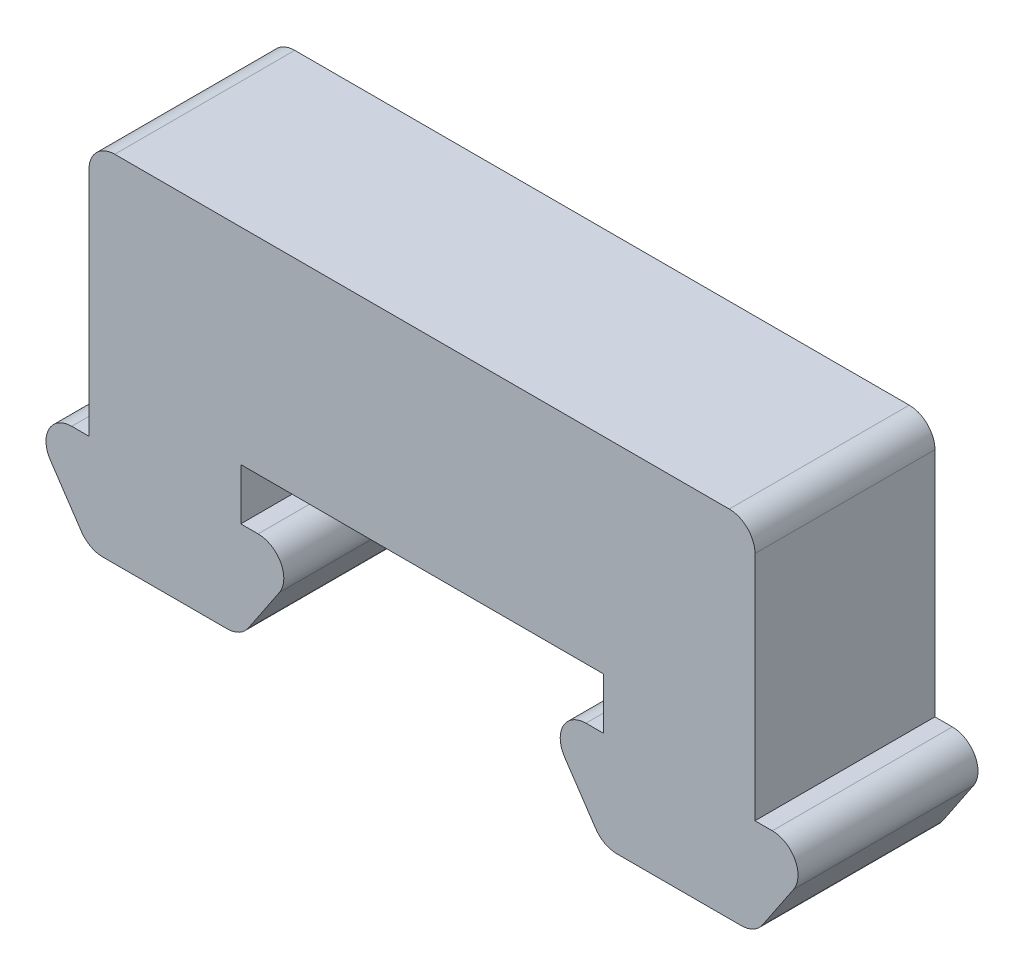
ISO-10303-21;
HEADER;
FILE_DESCRIPTION(('STEP AP214'),'2;1');
FILE_NAME('part.step','',(''),(''),'','','');
FILE_SCHEMA(('AUTOMOTIVE_DESIGN { 1 0 10303 214 1 1 1 1 }'));
ENDSEC;
DATA;
#1=APPLICATION_CONTEXT('core data for automotive mechanical design processes');
#2=APPLICATION_PROTOCOL_DEFINITION('international standard','automotive_design',2000,#1);
#3=PRODUCT_CONTEXT('',#1,'mechanical');
#4=PRODUCT('Part','Part','',(#3));
#5=PRODUCT_RELATED_PRODUCT_CATEGORY('part','',(#4));
#6=PRODUCT_DEFINITION_FORMATION('','',#4);
#7=PRODUCT_DEFINITION_CONTEXT('part definition',#1,'design');
#8=PRODUCT_DEFINITION('design','',#6,#7);
#9=PRODUCT_DEFINITION_SHAPE('','',#8);
#10=(LENGTH_UNIT() NAMED_UNIT(*) SI_UNIT(.MILLI.,.METRE.));
#11=(NAMED_UNIT(*) PLANE_ANGLE_UNIT() SI_UNIT($,.RADIAN.));
#12=(NAMED_UNIT(*) SI_UNIT($,.STERADIAN.) SOLID_ANGLE_UNIT());
#13=UNCERTAINTY_MEASURE_WITH_UNIT(LENGTH_MEASURE(1.E-05),#10,'distance_accuracy_value','');
#14=(GEOMETRIC_REPRESENTATION_CONTEXT(3) GLOBAL_UNCERTAINTY_ASSIGNED_CONTEXT((#13)) GLOBAL_UNIT_ASSIGNED_CONTEXT((#10,
#11,#12)) REPRESENTATION_CONTEXT('',''));
#15=CARTESIAN_POINT('',(0.,0.,0.));
#16=DIRECTION('',(0.,0.,1.));
#17=DIRECTION('',(1.,0.,0.));
#18=AXIS2_PLACEMENT_3D('',#15,#16,#17);
#19=CARTESIAN_POINT('',(-7.05,0.,5.));
#20=DIRECTION('',(-1.,0.,0.));
#21=DIRECTION('',(0.,0.,1.));
#22=AXIS2_PLACEMENT_3D('',#19,#20,#21);
#23=PLANE('',#22);
#24=DIRECTION('',(0.,1.,0.));
#25=VECTOR('',#24,1.);
#26=CARTESIAN_POINT('',(-7.05,0.,0.));
#27=LINE('',#26,#25);
#28=CARTESIAN_POINT('',(-7.05,0.,0.));
#29=VERTEX_POINT('',#28);
#30=CARTESIAN_POINT('',(-7.05,2.,0.));
#31=VERTEX_POINT('',#30);
#32=EDGE_CURVE('E317',#29,#31,#27,.T.);
#33=ORIENTED_EDGE('',*,*,#32,.T.);
#34=DIRECTION('',(0.,0.,-1.));
#35=VECTOR('',#34,1.);
#36=CARTESIAN_POINT('',(-7.05,2.,5.));
#37=LINE('',#36,#35);
#38=CARTESIAN_POINT('',(-7.05,2.,7.));
#39=VERTEX_POINT('',#38);
#40=EDGE_CURVE('E277',#39,#31,#37,.T.);
#41=ORIENTED_EDGE('',*,*,#40,.F.);
#42=DIRECTION('',(0.,-1.,0.));
#43=VECTOR('',#42,1.);
#44=CARTESIAN_POINT('',(-7.05,0.,7.));
#45=LINE('',#44,#43);
#46=CARTESIAN_POINT('',(-7.05,0.,7.));
#47=VERTEX_POINT('',#46);
#48=EDGE_CURVE('E270',#39,#47,#45,.T.);
#49=ORIENTED_EDGE('',*,*,#48,.T.);
#50=DIRECTION('',(0.,0.,-1.));
#51=VECTOR('',#50,1.);
#52=CARTESIAN_POINT('',(-7.05,0.,5.));
#53=LINE('',#52,#51);
#54=EDGE_CURVE('E251',#47,#29,#53,.T.);
#55=ORIENTED_EDGE('',*,*,#54,.T.);
#56=EDGE_LOOP('',(#33,#41,#49,#55));
#57=FACE_BOUND('',#56,.T.);
#58=ADVANCED_FACE('F39',(#57),#23,.F.);
#59=CARTESIAN_POINT('',(-4.6,0.,5.));
#60=DIRECTION('',(1.,0.,0.));
#61=DIRECTION('',(0.,1.,0.));
#62=AXIS2_PLACEMENT_3D('',#59,#60,#61);
#63=PLANE('',#62);
#64=DIRECTION('',(0.,-1.,0.));
#65=VECTOR('',#64,1.);
#66=CARTESIAN_POINT('',(-4.6,0.,5.));
#67=LINE('',#66,#65);
#68=CARTESIAN_POINT('',(-4.6,8.5,5.));
#69=VERTEX_POINT('',#68);
#70=CARTESIAN_POINT('',(-4.6,2.99999999999999,5.));
#71=VERTEX_POINT('',#70);
#72=EDGE_CURVE('E319',#69,#71,#67,.T.);
#73=ORIENTED_EDGE('',*,*,#72,.T.);
#74=DIRECTION('',(0.,0.,-1.));
#75=VECTOR('',#74,1.);
#76=CARTESIAN_POINT('',(-4.6,2.99999999999999,0.));
#77=LINE('',#76,#75);
#78=CARTESIAN_POINT('',(-4.6,2.99999999999999,0.));
#79=VERTEX_POINT('',#78);
#80=EDGE_CURVE('E396',#71,#79,#77,.T.);
#81=ORIENTED_EDGE('',*,*,#80,.T.);
#82=DIRECTION('',(0.,-1.,0.));
#83=VECTOR('',#82,1.);
#84=CARTESIAN_POINT('',(-4.6,0.,0.));
#85=LINE('',#84,#83);
#86=CARTESIAN_POINT('',(-4.6,8.5,0.));
#87=VERTEX_POINT('',#86);
#88=EDGE_CURVE('E331',#87,#79,#85,.T.);
#89=ORIENTED_EDGE('',*,*,#88,.F.);
#90=DIRECTION('',(0.,0.,-1.));
#91=VECTOR('',#90,1.);
#92=CARTESIAN_POINT('',(-4.6,8.5,5.));
#93=LINE('',#92,#91);
#94=EDGE_CURVE('E392',#69,#87,#93,.T.);
#95=ORIENTED_EDGE('',*,*,#94,.F.);
#96=EDGE_LOOP('',(#73,#81,#89,#95));
#97=FACE_BOUND('',#96,.T.);
#98=ADVANCED_FACE('F504',(#97),#63,.T.);
#99=CARTESIAN_POINT('',(0.,8.5,5.));
#100=DIRECTION('',(0.,1.,0.));
#101=DIRECTION('',(0.,0.,1.));
#102=AXIS2_PLACEMENT_3D('',#99,#100,#101);
#103=PLANE('',#102);
#104=DIRECTION('',(1.,0.,0.));
#105=VECTOR('',#104,1.);
#106=CARTESIAN_POINT('',(0.,8.5,0.));
#107=LINE('',#106,#105);
#108=CARTESIAN_POINT('',(4.6,8.5,0.));
#109=VERTEX_POINT('',#108);
#110=EDGE_CURVE('E335',#87,#109,#107,.T.);
#111=ORIENTED_EDGE('',*,*,#110,.T.);
#112=DIRECTION('',(0.,0.,-1.));
#113=VECTOR('',#112,1.);
#114=CARTESIAN_POINT('',(4.6,8.5,5.));
#115=LINE('',#114,#113);
#116=CARTESIAN_POINT('',(4.6,8.5,5.));
#117=VERTEX_POINT('',#116);
#118=EDGE_CURVE('E389',#117,#109,#115,.T.);
#119=ORIENTED_EDGE('',*,*,#118,.F.);
#120=DIRECTION('',(1.,0.,0.));
#121=VECTOR('',#120,1.);
#122=CARTESIAN_POINT('',(0.,8.5,5.));
#123=LINE('',#122,#121);
#124=EDGE_CURVE('E322',#69,#117,#123,.T.);
#125=ORIENTED_EDGE('',*,*,#124,.F.);
#126=ORIENTED_EDGE('',*,*,#94,.T.);
#127=EDGE_LOOP('',(#111,#119,#125,#126));
#128=FACE_BOUND('',#127,.T.);
#129=ADVANCED_FACE('F538',(#128),#103,.F.);
#130=CARTESIAN_POINT('',(4.6,0.,5.));
#131=DIRECTION('',(1.,0.,0.));
#132=DIRECTION('',(0.,1.,0.));
#133=AXIS2_PLACEMENT_3D('',#130,#131,#132);
#134=PLANE('',#133);
#135=DIRECTION('',(0.,-1.,0.));
#136=VECTOR('',#135,1.);
#137=CARTESIAN_POINT('',(4.6,0.,0.));
#138=LINE('',#137,#136);
#139=CARTESIAN_POINT('',(4.6,3.,0.));
#140=VERTEX_POINT('',#139);
#141=EDGE_CURVE('E338',#109,#140,#138,.T.);
#142=ORIENTED_EDGE('',*,*,#141,.T.);
#143=DIRECTION('',(0.,0.,-1.));
#144=VECTOR('',#143,1.);
#145=CARTESIAN_POINT('',(4.6,3.,5.));
#146=LINE('',#145,#144);
#147=CARTESIAN_POINT('',(4.6,3.,5.));
#148=VERTEX_POINT('',#147);
#149=EDGE_CURVE('E429',#140,#148,#146,.F.);
#150=ORIENTED_EDGE('',*,*,#149,.T.);
#151=DIRECTION('',(0.,-1.,0.));
#152=VECTOR('',#151,1.);
#153=CARTESIAN_POINT('',(4.6,0.,5.));
#154=LINE('',#153,#152);
#155=EDGE_CURVE('E264',#117,#148,#154,.T.);
#156=ORIENTED_EDGE('',*,*,#155,.F.);
#157=ORIENTED_EDGE('',*,*,#118,.T.);
#158=EDGE_LOOP('',(#142,#150,#156,#157));
#159=FACE_BOUND('',#158,.T.);
#160=ADVANCED_FACE('F601',(#159),#134,.F.);
#161=CARTESIAN_POINT('',(0.,1.99999999999999,5.));
#162=DIRECTION('',(0.,1.,0.));
#163=DIRECTION('',(-1.,0.,0.));
#164=AXIS2_PLACEMENT_3D('',#161,#162,#163);
#165=PLANE('',#164);
#166=DIRECTION('',(1.,0.,0.));
#167=VECTOR('',#166,1.);
#168=CARTESIAN_POINT('',(0.,2.,0.));
#169=LINE('',#168,#167);
#170=CARTESIAN_POINT('',(-5.6,2.,0.));
#171=VERTEX_POINT('',#170);
#172=EDGE_CURVE('E328',#31,#171,#169,.T.);
#173=ORIENTED_EDGE('',*,*,#172,.T.);
#174=DIRECTION('',(0.,0.,-1.));
#175=VECTOR('',#174,1.);
#176=CARTESIAN_POINT('',(-5.6,1.99999999999999,5.));
#177=LINE('',#176,#175);
#178=CARTESIAN_POINT('',(-5.6,2.,5.));
#179=VERTEX_POINT('',#178);
#180=EDGE_CURVE('E426',#171,#179,#177,.F.);
#181=ORIENTED_EDGE('',*,*,#180,.T.);
#182=DIRECTION('',(-1.,0.,0.));
#183=VECTOR('',#182,1.);
#184=CARTESIAN_POINT('',(0.,2.,5.));
#185=LINE('',#184,#183);
#186=CARTESIAN_POINT('',(5.6,2.,5.));
#187=VERTEX_POINT('',#186);
#188=EDGE_CURVE('E278',#187,#179,#185,.T.);
#189=ORIENTED_EDGE('',*,*,#188,.F.);
#190=DIRECTION('',(0.,0.,-1.));
#191=VECTOR('',#190,1.);
#192=CARTESIAN_POINT('',(5.6,2.,5.));
#193=LINE('',#192,#191);
#194=CARTESIAN_POINT('',(5.6,2.,0.));
#195=VERTEX_POINT('',#194);
#196=EDGE_CURVE('E423',#187,#195,#193,.T.);
#197=ORIENTED_EDGE('',*,*,#196,.T.);
#198=DIRECTION('',(1.,0.,0.));
#199=VECTOR('',#198,1.);
#200=CARTESIAN_POINT('',(0.,1.99999999999999,0.));
#201=LINE('',#200,#199);
#202=CARTESIAN_POINT('',(7.05,2.,0.));
#203=VERTEX_POINT('',#202);
#204=EDGE_CURVE('E341',#195,#203,#201,.T.);
#205=ORIENTED_EDGE('',*,*,#204,.T.);
#206=DIRECTION('',(0.,0.,-1.));
#207=VECTOR('',#206,1.);
#208=CARTESIAN_POINT('',(7.05,2.,5.));
#209=LINE('',#208,#207);
#210=CARTESIAN_POINT('',(7.05,2.,7.));
#211=VERTEX_POINT('',#210);
#212=EDGE_CURVE('E386',#211,#203,#209,.T.);
#213=ORIENTED_EDGE('',*,*,#212,.F.);
#214=DIRECTION('',(-1.,0.,0.));
#215=VECTOR('',#214,1.);
#216=CARTESIAN_POINT('',(0.,2.,7.));
#217=LINE('',#216,#215);
#218=EDGE_CURVE('E316',#211,#39,#217,.T.);
#219=ORIENTED_EDGE('',*,*,#218,.T.);
#220=ORIENTED_EDGE('',*,*,#40,.T.);
#221=EDGE_LOOP('',(#173,#181,#189,#197,#205,#213,#219,#220));
#222=FACE_BOUND('',#221,.T.);
#223=ADVANCED_FACE('F512',(#222),#165,.F.);
#224=CARTESIAN_POINT('',(7.05,0.,5.));
#225=DIRECTION('',(-1.,0.,0.));
#226=DIRECTION('',(0.,-1.,0.));
#227=AXIS2_PLACEMENT_3D('',#224,#225,#226);
#228=PLANE('',#227);
#229=DIRECTION('',(0.,1.,0.));
#230=VECTOR('',#229,1.);
#231=CARTESIAN_POINT('',(7.05,0.,0.));
#232=LINE('',#231,#230);
#233=CARTESIAN_POINT('',(7.05,0.,0.));
#234=VERTEX_POINT('',#233);
#235=EDGE_CURVE('E343',#234,#203,#232,.T.);
#236=ORIENTED_EDGE('',*,*,#235,.F.);
#237=DIRECTION('',(0.,0.,-1.));
#238=VECTOR('',#237,1.);
#239=CARTESIAN_POINT('',(7.05,0.,5.));
#240=LINE('',#239,#238);
#241=CARTESIAN_POINT('',(7.05,0.,7.));
#242=VERTEX_POINT('',#241);
#243=EDGE_CURVE('E383',#242,#234,#240,.T.);
#244=ORIENTED_EDGE('',*,*,#243,.F.);
#245=DIRECTION('',(0.,-1.,0.));
#246=VECTOR('',#245,1.);
#247=CARTESIAN_POINT('',(7.05,0.,7.));
#248=LINE('',#247,#246);
#249=EDGE_CURVE('E313',#211,#242,#248,.T.);
#250=ORIENTED_EDGE('',*,*,#249,.F.);
#251=ORIENTED_EDGE('',*,*,#212,.T.);
#252=EDGE_LOOP('',(#236,#244,#250,#251));
#253=FACE_BOUND('',#252,.T.);
#254=ADVANCED_FACE('F595',(#253),#228,.T.);
#255=CARTESIAN_POINT('',(0.,0.,5.));
#256=DIRECTION('',(0.,1.,0.));
#257=DIRECTION('',(-1.,0.,0.));
#258=AXIS2_PLACEMENT_3D('',#255,#256,#257);
#259=PLANE('',#258);
#260=DIRECTION('',(1.,0.,0.));
#261=VECTOR('',#260,1.);
#262=CARTESIAN_POINT('',(0.,0.,0.));
#263=LINE('',#262,#261);
#264=CARTESIAN_POINT('',(6.37534148162657,0.,0.));
#265=VERTEX_POINT('',#264);
#266=EDGE_CURVE('E346',#265,#234,#263,.T.);
#267=ORIENTED_EDGE('',*,*,#266,.F.);
#268=DIRECTION('',(0.,0.,-1.));
#269=VECTOR('',#268,1.);
#270=CARTESIAN_POINT('',(6.37534148162657,0.,5.));
#271=LINE('',#270,#269);
#272=CARTESIAN_POINT('',(6.37534148162657,0.,7.));
#273=VERTEX_POINT('',#272);
#274=EDGE_CURVE('E495',#265,#273,#271,.F.);
#275=ORIENTED_EDGE('',*,*,#274,.T.);
#276=DIRECTION('',(-1.,0.,0.));
#277=VECTOR('',#276,1.);
#278=CARTESIAN_POINT('',(0.,0.,7.));
#279=LINE('',#278,#277);
#280=EDGE_CURVE('E310',#242,#273,#279,.T.);
#281=ORIENTED_EDGE('',*,*,#280,.F.);
#282=ORIENTED_EDGE('',*,*,#243,.T.);
#283=EDGE_LOOP('',(#267,#275,#281,#282));
#284=FACE_BOUND('',#283,.T.);
#285=ADVANCED_FACE('F583',(#284),#259,.T.);
#286=CARTESIAN_POINT('',(3.10278142533126,2.08212964068282,5.));
#287=DIRECTION('',(-0.83036557214696,-0.557219002361776,0.));
#288=DIRECTION('',(0.557219002361776,-0.83036557214696,0.));
#289=AXIS2_PLACEMENT_3D('',#286,#287,#288);
#290=PLANE('',#289);
#291=DIRECTION('',(-0.557219002361776,0.83036557214696,0.));
#292=VECTOR('',#291,1.);
#293=CARTESIAN_POINT('',(3.10278142533126,2.08212964068282,0.));
#294=LINE('',#293,#292);
#295=CARTESIAN_POINT('',(6.75287064632172,-3.35721900236178,0.));
#296=VERTEX_POINT('',#295);
#297=CARTESIAN_POINT('',(5.54497590947962,-1.55721900236178,0.));
#298=VERTEX_POINT('',#297);
#299=EDGE_CURVE('E348',#296,#298,#294,.T.);
#300=ORIENTED_EDGE('',*,*,#299,.F.);
#301=DIRECTION('',(0.,0.,-1.));
#302=VECTOR('',#301,1.);
#303=CARTESIAN_POINT('',(6.75287064632172,-3.35721900236177,7.));
#304=LINE('',#303,#302);
#305=CARTESIAN_POINT('',(6.75287064632172,-3.35721900236178,7.));
#306=VERTEX_POINT('',#305);
#307=EDGE_CURVE('E493',#296,#306,#304,.F.);
#308=ORIENTED_EDGE('',*,*,#307,.T.);
#309=DIRECTION('',(0.557219002361776,-0.83036557214696,0.));
#310=VECTOR('',#309,1.);
#311=CARTESIAN_POINT('',(3.10278142533126,2.08212964068282,7.));
#312=LINE('',#311,#310);
#313=CARTESIAN_POINT('',(5.54497590947962,-1.55721900236178,7.));
#314=VERTEX_POINT('',#313);
#315=EDGE_CURVE('E307',#314,#306,#312,.T.);
#316=ORIENTED_EDGE('',*,*,#315,.F.);
#317=DIRECTION('',(0.,0.,-1.));
#318=VECTOR('',#317,1.);
#319=CARTESIAN_POINT('',(5.54497590947961,-1.55721900236178,5.));
#320=LINE('',#319,#318);
#321=EDGE_CURVE('E490',#314,#298,#320,.T.);
#322=ORIENTED_EDGE('',*,*,#321,.T.);
#323=EDGE_LOOP('',(#300,#308,#316,#322));
#324=FACE_BOUND('',#323,.T.);
#325=ADVANCED_FACE('F590',(#324),#290,.T.);
#326=CARTESIAN_POINT('',(0.,-3.8,5.));
#327=DIRECTION('',(0.,1.,0.));
#328=DIRECTION('',(-1.,0.,0.));
#329=AXIS2_PLACEMENT_3D('',#326,#327,#328);
#330=PLANE('',#329);
#331=DIRECTION('',(1.,0.,0.));
#332=VECTOR('',#331,1.);
#333=CARTESIAN_POINT('',(0.,-3.8,0.));
#334=LINE('',#333,#332);
#335=CARTESIAN_POINT('',(7.58323621846868,-3.8,0.));
#336=VERTEX_POINT('',#335);
#337=CARTESIAN_POINT('',(12.4167637815313,-3.8,0.));
#338=VERTEX_POINT('',#337);
#339=EDGE_CURVE('E352',#336,#338,#334,.T.);
#340=ORIENTED_EDGE('',*,*,#339,.T.);
#341=DIRECTION('',(0.,0.,-1.));
#342=VECTOR('',#341,1.);
#343=CARTESIAN_POINT('',(12.4167637815313,-3.8,5.));
#344=LINE('',#343,#342);
#345=CARTESIAN_POINT('',(12.4167637815313,-3.8,7.));
#346=VERTEX_POINT('',#345);
#347=EDGE_CURVE('E488',#338,#346,#344,.F.);
#348=ORIENTED_EDGE('',*,*,#347,.T.);
#349=DIRECTION('',(-1.,0.,0.));
#350=VECTOR('',#349,1.);
#351=CARTESIAN_POINT('',(0.,-3.8,7.));
#352=LINE('',#351,#350);
#353=CARTESIAN_POINT('',(7.58323621846868,-3.8,7.));
#354=VERTEX_POINT('',#353);
#355=EDGE_CURVE('E304',#346,#354,#352,.T.);
#356=ORIENTED_EDGE('',*,*,#355,.T.);
#357=DIRECTION('',(0.,0.,-1.));
#358=VECTOR('',#357,1.);
#359=CARTESIAN_POINT('',(7.58323621846868,-3.8,0.));
#360=LINE('',#359,#358);
#361=EDGE_CURVE('E485',#354,#336,#360,.T.);
#362=ORIENTED_EDGE('',*,*,#361,.T.);
#363=EDGE_LOOP('',(#340,#348,#356,#362));
#364=FACE_BOUND('',#363,.T.);
#365=ADVANCED_FACE('F586',(#364),#330,.F.);
#366=CARTESIAN_POINT('',(10.6873582428077,-7.17177987346305,5.));
#367=DIRECTION('',(-0.83036557214696,0.557219002361775,0.));
#368=DIRECTION('',(-0.557219002361775,-0.83036557214696,0.));
#369=AXIS2_PLACEMENT_3D('',#366,#367,#368);
#370=PLANE('',#369);
#371=DIRECTION('',(0.557219002361775,0.83036557214696,0.));
#372=VECTOR('',#371,1.);
#373=CARTESIAN_POINT('',(10.6873582428077,-7.17177987346305,0.));
#374=LINE('',#373,#372);
#375=CARTESIAN_POINT('',(13.2471293536783,-3.35721900236177,0.));
#376=VERTEX_POINT('',#375);
#377=CARTESIAN_POINT('',(14.4550240905204,-1.55721900236178,0.));
#378=VERTEX_POINT('',#377);
#379=EDGE_CURVE('E355',#376,#378,#374,.T.);
#380=ORIENTED_EDGE('',*,*,#379,.T.);
#381=DIRECTION('',(0.,0.,-1.));
#382=VECTOR('',#381,1.);
#383=CARTESIAN_POINT('',(14.4550240905204,-1.55721900236178,7.));
#384=LINE('',#383,#382);
#385=CARTESIAN_POINT('',(14.4550240905204,-1.55721900236178,7.));
#386=VERTEX_POINT('',#385);
#387=EDGE_CURVE('E483',#378,#386,#384,.F.);
#388=ORIENTED_EDGE('',*,*,#387,.T.);
#389=DIRECTION('',(-0.557219002361775,-0.83036557214696,0.));
#390=VECTOR('',#389,1.);
#391=CARTESIAN_POINT('',(10.6873582428077,-7.17177987346305,7.));
#392=LINE('',#391,#390);
#393=CARTESIAN_POINT('',(13.2471293536783,-3.35721900236177,7.));
#394=VERTEX_POINT('',#393);
#395=EDGE_CURVE('E301',#386,#394,#392,.T.);
#396=ORIENTED_EDGE('',*,*,#395,.T.);
#397=DIRECTION('',(0.,0.,-1.));
#398=VECTOR('',#397,1.);
#399=CARTESIAN_POINT('',(13.2471293536783,-3.35721900236177,5.));
#400=LINE('',#399,#398);
#401=EDGE_CURVE('E480',#394,#376,#400,.T.);
#402=ORIENTED_EDGE('',*,*,#401,.T.);
#403=EDGE_LOOP('',(#380,#388,#396,#402));
#404=FACE_BOUND('',#403,.T.);
#405=ADVANCED_FACE('F581',(#404),#370,.F.);
#406=DIRECTION('',(-1.,0.,0.));
#407=VECTOR('',#406,1.);
#408=CARTESIAN_POINT('',(0.,0.,7.));
#409=LINE('',#408,#407);
#410=CARTESIAN_POINT('',(13.6246585183734,0.,7.));
#411=VERTEX_POINT('',#410);
#412=CARTESIAN_POINT('',(12.95,0.,7.));
#413=VERTEX_POINT('',#412);
#414=EDGE_CURVE('E298',#411,#413,#409,.T.);
#415=ORIENTED_EDGE('',*,*,#414,.F.);
#416=DIRECTION('',(0.,0.,-1.));
#417=VECTOR('',#416,1.);
#418=CARTESIAN_POINT('',(13.6246585183734,0.,0.));
#419=LINE('',#418,#417);
#420=CARTESIAN_POINT('',(13.6246585183734,0.,0.));
#421=VERTEX_POINT('',#420);
#422=EDGE_CURVE('E477',#411,#421,#419,.T.);
#423=ORIENTED_EDGE('',*,*,#422,.T.);
#424=CARTESIAN_POINT('',(12.95,0.,0.));
#425=VERTEX_POINT('',#424);
#426=EDGE_CURVE('E349',#425,#421,#263,.T.);
#427=ORIENTED_EDGE('',*,*,#426,.F.);
#428=DIRECTION('',(0.,0.,-1.));
#429=VECTOR('',#428,1.);
#430=CARTESIAN_POINT('',(12.95,0.,5.));
#431=LINE('',#430,#429);
#432=EDGE_CURVE('E381',#413,#425,#431,.T.);
#433=ORIENTED_EDGE('',*,*,#432,.F.);
#434=EDGE_LOOP('',(#415,#423,#427,#433));
#435=FACE_BOUND('',#434,.T.);
#436=ADVANCED_FACE('F577',(#435),#259,.T.);
#437=CARTESIAN_POINT('',(12.95,0.,5.));
#438=DIRECTION('',(-1.,0.,0.));
#439=DIRECTION('',(0.,0.,1.));
#440=AXIS2_PLACEMENT_3D('',#437,#438,#439);
#441=PLANE('',#440);
#442=DIRECTION('',(0.,1.,0.));
#443=VECTOR('',#442,1.);
#444=CARTESIAN_POINT('',(12.95,0.,0.));
#445=LINE('',#444,#443);
#446=CARTESIAN_POINT('',(12.95,9.,0.));
#447=VERTEX_POINT('',#446);
#448=EDGE_CURVE('E358',#425,#447,#445,.T.);
#449=ORIENTED_EDGE('',*,*,#448,.T.);
#450=DIRECTION('',(0.,0.,-1.));
#451=VECTOR('',#450,1.);
#452=CARTESIAN_POINT('',(12.95,9.,7.));
#453=LINE('',#452,#451);
#454=CARTESIAN_POINT('',(12.95,9.,7.));
#455=VERTEX_POINT('',#454);
#456=EDGE_CURVE('E475',#447,#455,#453,.F.);
#457=ORIENTED_EDGE('',*,*,#456,.T.);
#458=DIRECTION('',(0.,-1.,0.));
#459=VECTOR('',#458,1.);
#460=CARTESIAN_POINT('',(12.95,0.,7.));
#461=LINE('',#460,#459);
#462=EDGE_CURVE('E296',#455,#413,#461,.T.);
#463=ORIENTED_EDGE('',*,*,#462,.T.);
#464=ORIENTED_EDGE('',*,*,#432,.T.);
#465=EDGE_LOOP('',(#449,#457,#463,#464));
#466=FACE_BOUND('',#465,.T.);
#467=ADVANCED_FACE('F573',(#466),#441,.F.);
#468=CARTESIAN_POINT('',(0.,10.,5.));
#469=DIRECTION('',(0.,1.,0.));
#470=DIRECTION('',(-1.,0.,0.));
#471=AXIS2_PLACEMENT_3D('',#468,#469,#470);
#472=PLANE('',#471);
#473=DIRECTION('',(1.,0.,0.));
#474=VECTOR('',#473,1.);
#475=CARTESIAN_POINT('',(0.,10.,0.));
#476=LINE('',#475,#474);
#477=CARTESIAN_POINT('',(-11.95,10.,0.));
#478=VERTEX_POINT('',#477);
#479=CARTESIAN_POINT('',(11.95,10.,0.));
#480=VERTEX_POINT('',#479);
#481=EDGE_CURVE('E361',#478,#480,#476,.T.);
#482=ORIENTED_EDGE('',*,*,#481,.F.);
#483=DIRECTION('',(0.,0.,-1.));
#484=VECTOR('',#483,1.);
#485=CARTESIAN_POINT('',(-11.95,10.,5.));
#486=LINE('',#485,#484);
#487=CARTESIAN_POINT('',(-11.95,10.,7.));
#488=VERTEX_POINT('',#487);
#489=EDGE_CURVE('E473',#478,#488,#486,.F.);
#490=ORIENTED_EDGE('',*,*,#489,.T.);
#491=DIRECTION('',(-1.,0.,0.));
#492=VECTOR('',#491,1.);
#493=CARTESIAN_POINT('',(0.,10.,7.));
#494=LINE('',#493,#492);
#495=CARTESIAN_POINT('',(11.95,10.,7.));
#496=VERTEX_POINT('',#495);
#497=EDGE_CURVE('E293',#496,#488,#494,.T.);
#498=ORIENTED_EDGE('',*,*,#497,.F.);
#499=DIRECTION('',(0.,0.,-1.));
#500=VECTOR('',#499,1.);
#501=CARTESIAN_POINT('',(11.95,10.,0.));
#502=LINE('',#501,#500);
#503=EDGE_CURVE('E470',#496,#480,#502,.T.);
#504=ORIENTED_EDGE('',*,*,#503,.T.);
#505=EDGE_LOOP('',(#482,#490,#498,#504));
#506=FACE_BOUND('',#505,.T.);
#507=ADVANCED_FACE('F569',(#506),#472,.T.);
#508=CARTESIAN_POINT('',(-12.95,0.,5.));
#509=DIRECTION('',(-1.,0.,0.));
#510=DIRECTION('',(0.,0.,1.));
#511=AXIS2_PLACEMENT_3D('',#508,#509,#510);
#512=PLANE('',#511);
#513=DIRECTION('',(0.,-1.,0.));
#514=VECTOR('',#513,1.);
#515=CARTESIAN_POINT('',(-12.95,0.,7.));
#516=LINE('',#515,#514);
#517=CARTESIAN_POINT('',(-12.95,9.,7.));
#518=VERTEX_POINT('',#517);
#519=CARTESIAN_POINT('',(-12.95,0.,7.));
#520=VERTEX_POINT('',#519);
#521=EDGE_CURVE('E290',#518,#520,#516,.T.);
#522=ORIENTED_EDGE('',*,*,#521,.F.);
#523=DIRECTION('',(0.,0.,-1.));
#524=VECTOR('',#523,1.);
#525=CARTESIAN_POINT('',(-12.95,9.,5.));
#526=LINE('',#525,#524);
#527=CARTESIAN_POINT('',(-12.95,9.,0.));
#528=VERTEX_POINT('',#527);
#529=EDGE_CURVE('E467',#518,#528,#526,.T.);
#530=ORIENTED_EDGE('',*,*,#529,.T.);
#531=DIRECTION('',(0.,1.,0.));
#532=VECTOR('',#531,1.);
#533=CARTESIAN_POINT('',(-12.95,0.,0.));
#534=LINE('',#533,#532);
#535=CARTESIAN_POINT('',(-12.95,0.,0.));
#536=VERTEX_POINT('',#535);
#537=EDGE_CURVE('E365',#536,#528,#534,.T.);
#538=ORIENTED_EDGE('',*,*,#537,.F.);
#539=DIRECTION('',(0.,0.,-1.));
#540=VECTOR('',#539,1.);
#541=CARTESIAN_POINT('',(-12.95,0.,5.));
#542=LINE('',#541,#540);
#543=EDGE_CURVE('E263',#520,#536,#542,.T.);
#544=ORIENTED_EDGE('',*,*,#543,.F.);
#545=EDGE_LOOP('',(#522,#530,#538,#544));
#546=FACE_BOUND('',#545,.T.);
#547=ADVANCED_FACE('F566',(#546),#512,.T.);
#548=CARTESIAN_POINT('',(0.,0.,5.));
#549=DIRECTION('',(0.,-1.,0.));
#550=DIRECTION('',(1.,0.,0.));
#551=AXIS2_PLACEMENT_3D('',#548,#549,#550);
#552=PLANE('',#551);
#553=DIRECTION('',(-1.,0.,0.));
#554=VECTOR('',#553,1.);
#555=CARTESIAN_POINT('',(0.,0.,0.));
#556=LINE('',#555,#554);
#557=CARTESIAN_POINT('',(-13.6246585183734,0.,0.));
#558=VERTEX_POINT('',#557);
#559=EDGE_CURVE('E368',#536,#558,#556,.T.);
#560=ORIENTED_EDGE('',*,*,#559,.T.);
#561=DIRECTION('',(0.,0.,-1.));
#562=VECTOR('',#561,1.);
#563=CARTESIAN_POINT('',(-13.6246585183734,0.,7.));
#564=LINE('',#563,#562);
#565=CARTESIAN_POINT('',(-13.6246585183734,0.,7.));
#566=VERTEX_POINT('',#565);
#567=EDGE_CURVE('E465',#558,#566,#564,.F.);
#568=ORIENTED_EDGE('',*,*,#567,.T.);
#569=DIRECTION('',(1.,0.,0.));
#570=VECTOR('',#569,1.);
#571=CARTESIAN_POINT('',(0.,0.,7.));
#572=LINE('',#571,#570);
#573=EDGE_CURVE('E288',#566,#520,#572,.T.);
#574=ORIENTED_EDGE('',*,*,#573,.T.);
#575=ORIENTED_EDGE('',*,*,#543,.T.);
#576=EDGE_LOOP('',(#560,#568,#574,#575));
#577=FACE_BOUND('',#576,.T.);
#578=ADVANCED_FACE('F556',(#577),#552,.F.);
#579=CARTESIAN_POINT('',(-10.6873582428077,-7.17177987346305,5.));
#580=DIRECTION('',(-0.83036557214696,-0.557219002361775,0.));
#581=DIRECTION('',(0.557219002361775,-0.83036557214696,0.));
#582=AXIS2_PLACEMENT_3D('',#579,#580,#581);
#583=PLANE('',#582);
#584=DIRECTION('',(-0.557219002361775,0.83036557214696,0.));
#585=VECTOR('',#584,1.);
#586=CARTESIAN_POINT('',(-10.6873582428077,-7.17177987346305,0.));
#587=LINE('',#586,#585);
#588=CARTESIAN_POINT('',(-13.2471293536783,-3.35721900236178,0.));
#589=VERTEX_POINT('',#588);
#590=CARTESIAN_POINT('',(-14.4550240905204,-1.55721900236178,0.));
#591=VERTEX_POINT('',#590);
#592=EDGE_CURVE('E371',#589,#591,#587,.T.);
#593=ORIENTED_EDGE('',*,*,#592,.F.);
#594=DIRECTION('',(0.,0.,-1.));
#595=VECTOR('',#594,1.);
#596=CARTESIAN_POINT('',(-13.2471293536783,-3.35721900236178,5.));
#597=LINE('',#596,#595);
#598=CARTESIAN_POINT('',(-13.2471293536783,-3.35721900236178,7.));
#599=VERTEX_POINT('',#598);
#600=EDGE_CURVE('E463',#589,#599,#597,.F.);
#601=ORIENTED_EDGE('',*,*,#600,.T.);
#602=DIRECTION('',(0.557219002361775,-0.83036557214696,0.));
#603=VECTOR('',#602,1.);
#604=CARTESIAN_POINT('',(-10.6873582428077,-7.17177987346305,7.));
#605=LINE('',#604,#603);
#606=CARTESIAN_POINT('',(-14.4550240905204,-1.55721900236178,7.));
#607=VERTEX_POINT('',#606);
#608=EDGE_CURVE('E286',#607,#599,#605,.T.);
#609=ORIENTED_EDGE('',*,*,#608,.F.);
#610=DIRECTION('',(0.,0.,-1.));
#611=VECTOR('',#610,1.);
#612=CARTESIAN_POINT('',(-14.4550240905204,-1.55721900236178,0.));
#613=LINE('',#612,#611);
#614=EDGE_CURVE('E460',#607,#591,#613,.T.);
#615=ORIENTED_EDGE('',*,*,#614,.T.);
#616=EDGE_LOOP('',(#593,#601,#609,#615));
#617=FACE_BOUND('',#616,.T.);
#618=ADVANCED_FACE('F562',(#617),#583,.T.);
#619=CARTESIAN_POINT('',(0.,-3.8,5.));
#620=DIRECTION('',(0.,-1.,0.));
#621=DIRECTION('',(0.,0.,-1.));
#622=AXIS2_PLACEMENT_3D('',#619,#620,#621);
#623=PLANE('',#622);
#624=DIRECTION('',(-1.,0.,0.));
#625=VECTOR('',#624,1.);
#626=CARTESIAN_POINT('',(0.,-3.8,0.));
#627=LINE('',#626,#625);
#628=CARTESIAN_POINT('',(-7.58323621846867,-3.8,0.));
#629=VERTEX_POINT('',#628);
#630=CARTESIAN_POINT('',(-12.4167637815313,-3.8,0.));
#631=VERTEX_POINT('',#630);
#632=EDGE_CURVE('E374',#629,#631,#627,.T.);
#633=ORIENTED_EDGE('',*,*,#632,.F.);
#634=DIRECTION('',(0.,0.,-1.));
#635=VECTOR('',#634,1.);
#636=CARTESIAN_POINT('',(-7.58323621846867,-3.8,7.));
#637=LINE('',#636,#635);
#638=CARTESIAN_POINT('',(-7.58323621846867,-3.8,7.));
#639=VERTEX_POINT('',#638);
#640=EDGE_CURVE('E54',#629,#639,#637,.F.);
#641=ORIENTED_EDGE('',*,*,#640,.T.);
#642=DIRECTION('',(1.,0.,0.));
#643=VECTOR('',#642,1.);
#644=CARTESIAN_POINT('',(0.,-3.8,7.));
#645=LINE('',#644,#643);
#646=CARTESIAN_POINT('',(-12.4167637815313,-3.8,7.));
#647=VERTEX_POINT('',#646);
#648=EDGE_CURVE('E284',#647,#639,#645,.T.);
#649=ORIENTED_EDGE('',*,*,#648,.F.);
#650=DIRECTION('',(0.,0.,-1.));
#651=VECTOR('',#650,1.);
#652=CARTESIAN_POINT('',(-12.4167637815313,-3.8,5.));
#653=LINE('',#652,#651);
#654=EDGE_CURVE('E456',#647,#631,#653,.T.);
#655=ORIENTED_EDGE('',*,*,#654,.T.);
#656=EDGE_LOOP('',(#633,#641,#649,#655));
#657=FACE_BOUND('',#656,.T.);
#658=ADVANCED_FACE('F559',(#657),#623,.T.);
#659=CARTESIAN_POINT('',(-3.10278142533127,2.08212964068282,5.));
#660=DIRECTION('',(-0.83036557214696,0.557219002361775,0.));
#661=DIRECTION('',(-0.557219002361775,-0.83036557214696,0.));
#662=AXIS2_PLACEMENT_3D('',#659,#660,#661);
#663=PLANE('',#662);
#664=DIRECTION('',(0.557219002361775,0.83036557214696,0.));
#665=VECTOR('',#664,1.);
#666=CARTESIAN_POINT('',(-3.10278142533127,2.08212964068282,0.));
#667=LINE('',#666,#665);
#668=CARTESIAN_POINT('',(-6.75287064632171,-3.35721900236177,0.));
#669=VERTEX_POINT('',#668);
#670=CARTESIAN_POINT('',(-5.54497590947961,-1.55721900236178,0.));
#671=VERTEX_POINT('',#670);
#672=EDGE_CURVE('E377',#669,#671,#667,.T.);
#673=ORIENTED_EDGE('',*,*,#672,.T.);
#674=DIRECTION('',(0.,0.,-1.));
#675=VECTOR('',#674,1.);
#676=CARTESIAN_POINT('',(-5.54497590947961,-1.55721900236178,5.));
#677=LINE('',#676,#675);
#678=CARTESIAN_POINT('',(-5.54497590947961,-1.55721900236178,7.));
#679=VERTEX_POINT('',#678);
#680=EDGE_CURVE('E436',#671,#679,#677,.F.);
#681=ORIENTED_EDGE('',*,*,#680,.T.);
#682=DIRECTION('',(-0.557219002361775,-0.83036557214696,0.));
#683=VECTOR('',#682,1.);
#684=CARTESIAN_POINT('',(-3.10278142533127,2.08212964068282,7.));
#685=LINE('',#684,#683);
#686=CARTESIAN_POINT('',(-6.75287064632172,-3.35721900236178,7.));
#687=VERTEX_POINT('',#686);
#688=EDGE_CURVE('E274',#679,#687,#685,.T.);
#689=ORIENTED_EDGE('',*,*,#688,.T.);
#690=DIRECTION('',(0.,0.,-1.));
#691=VECTOR('',#690,1.);
#692=CARTESIAN_POINT('',(-6.75287064632171,-3.35721900236178,0.));
#693=LINE('',#692,#691);
#694=EDGE_CURVE('E433',#687,#669,#693,.T.);
#695=ORIENTED_EDGE('',*,*,#694,.T.);
#696=EDGE_LOOP('',(#673,#681,#689,#695));
#697=FACE_BOUND('',#696,.T.);
#698=ADVANCED_FACE('F517',(#697),#663,.F.);
#699=DIRECTION('',(1.,0.,0.));
#700=VECTOR('',#699,1.);
#701=CARTESIAN_POINT('',(0.,0.,7.));
#702=LINE('',#701,#700);
#703=CARTESIAN_POINT('',(-6.37534148162657,0.,7.));
#704=VERTEX_POINT('',#703);
#705=EDGE_CURVE('E255',#47,#704,#702,.T.);
#706=ORIENTED_EDGE('',*,*,#705,.T.);
#707=DIRECTION('',(0.,0.,-1.));
#708=VECTOR('',#707,1.);
#709=CARTESIAN_POINT('',(-6.37534148162657,0.,5.));
#710=LINE('',#709,#708);
#711=CARTESIAN_POINT('',(-6.37534148162657,0.,0.));
#712=VERTEX_POINT('',#711);
#713=EDGE_CURVE('E431',#704,#712,#710,.T.);
#714=ORIENTED_EDGE('',*,*,#713,.T.);
#715=EDGE_CURVE('E258',#712,#29,#556,.T.);
#716=ORIENTED_EDGE('',*,*,#715,.T.);
#717=ORIENTED_EDGE('',*,*,#54,.F.);
#718=EDGE_LOOP('',(#706,#714,#716,#717));
#719=FACE_BOUND('',#718,.T.);
#720=ADVANCED_FACE('F253',(#719),#552,.F.);
#721=CARTESIAN_POINT('',(0.,0.,0.));
#722=DIRECTION('',(0.,0.,1.));
#723=DIRECTION('',(1.,0.,0.));
#724=AXIS2_PLACEMENT_3D('',#721,#722,#723);
#725=PLANE('',#724);
#726=ORIENTED_EDGE('',*,*,#88,.T.);
#727=CARTESIAN_POINT('',(-5.6,2.99999999999999,0.));
#728=DIRECTION('',(0.,0.,1.));
#729=DIRECTION('',(1.,0.,0.));
#730=AXIS2_PLACEMENT_3D('',#727,#728,#729);
#731=CIRCLE('',#730,1.);
#732=EDGE_CURVE('E421',#79,#171,#731,.F.);
#733=ORIENTED_EDGE('',*,*,#732,.T.);
#734=ORIENTED_EDGE('',*,*,#172,.F.);
#735=ORIENTED_EDGE('',*,*,#32,.F.);
#736=ORIENTED_EDGE('',*,*,#715,.F.);
#737=CARTESIAN_POINT('',(-6.37534148162657,-1.,0.));
#738=DIRECTION('',(0.,0.,1.));
#739=DIRECTION('',(1.,0.,0.));
#740=AXIS2_PLACEMENT_3D('',#737,#738,#739);
#741=CIRCLE('',#740,1.);
#742=EDGE_CURVE('E417',#712,#671,#741,.F.);
#743=ORIENTED_EDGE('',*,*,#742,.T.);
#744=ORIENTED_EDGE('',*,*,#672,.F.);
#745=CARTESIAN_POINT('',(-7.58323621846867,-2.8,0.));
#746=DIRECTION('',(0.,0.,1.));
#747=DIRECTION('',(1.,0.,0.));
#748=AXIS2_PLACEMENT_3D('',#745,#746,#747);
#749=CIRCLE('',#748,1.);
#750=EDGE_CURVE('E415',#669,#629,#749,.F.);
#751=ORIENTED_EDGE('',*,*,#750,.T.);
#752=ORIENTED_EDGE('',*,*,#632,.T.);
#753=CARTESIAN_POINT('',(-12.4167637815313,-2.8,0.));
#754=DIRECTION('',(0.,0.,1.));
#755=DIRECTION('',(1.,0.,0.));
#756=AXIS2_PLACEMENT_3D('',#753,#754,#755);
#757=CIRCLE('',#756,1.);
#758=EDGE_CURVE('E413',#631,#589,#757,.F.);
#759=ORIENTED_EDGE('',*,*,#758,.T.);
#760=ORIENTED_EDGE('',*,*,#592,.T.);
#761=CARTESIAN_POINT('',(-13.6246585183734,-1.,0.));
#762=DIRECTION('',(0.,0.,1.));
#763=DIRECTION('',(1.,0.,0.));
#764=AXIS2_PLACEMENT_3D('',#761,#762,#763);
#765=CIRCLE('',#764,1.);
#766=EDGE_CURVE('E411',#591,#558,#765,.F.);
#767=ORIENTED_EDGE('',*,*,#766,.T.);
#768=ORIENTED_EDGE('',*,*,#559,.F.);
#769=ORIENTED_EDGE('',*,*,#537,.T.);
#770=CARTESIAN_POINT('',(-11.95,9.,0.));
#771=DIRECTION('',(0.,0.,1.));
#772=DIRECTION('',(1.,0.,0.));
#773=AXIS2_PLACEMENT_3D('',#770,#771,#772);
#774=CIRCLE('',#773,1.);
#775=EDGE_CURVE('E409',#528,#478,#774,.F.);
#776=ORIENTED_EDGE('',*,*,#775,.T.);
#777=ORIENTED_EDGE('',*,*,#481,.T.);
#778=CARTESIAN_POINT('',(11.95,9.,0.));
#779=DIRECTION('',(0.,0.,1.));
#780=DIRECTION('',(1.,0.,0.));
#781=AXIS2_PLACEMENT_3D('',#778,#779,#780);
#782=CIRCLE('',#781,1.);
#783=EDGE_CURVE('E407',#480,#447,#782,.F.);
#784=ORIENTED_EDGE('',*,*,#783,.T.);
#785=ORIENTED_EDGE('',*,*,#448,.F.);
#786=ORIENTED_EDGE('',*,*,#426,.T.);
#787=CARTESIAN_POINT('',(13.6246585183734,-1.,0.));
#788=DIRECTION('',(0.,0.,1.));
#789=DIRECTION('',(1.,0.,0.));
#790=AXIS2_PLACEMENT_3D('',#787,#788,#789);
#791=CIRCLE('',#790,1.);
#792=EDGE_CURVE('E405',#421,#378,#791,.F.);
#793=ORIENTED_EDGE('',*,*,#792,.T.);
#794=ORIENTED_EDGE('',*,*,#379,.F.);
#795=CARTESIAN_POINT('',(12.4167637815313,-2.8,0.));
#796=DIRECTION('',(0.,0.,1.));
#797=DIRECTION('',(1.,0.,0.));
#798=AXIS2_PLACEMENT_3D('',#795,#796,#797);
#799=CIRCLE('',#798,1.);
#800=EDGE_CURVE('E403',#376,#338,#799,.F.);
#801=ORIENTED_EDGE('',*,*,#800,.T.);
#802=ORIENTED_EDGE('',*,*,#339,.F.);
#803=CARTESIAN_POINT('',(7.58323621846868,-2.8,0.));
#804=DIRECTION('',(0.,0.,1.));
#805=DIRECTION('',(1.,0.,0.));
#806=AXIS2_PLACEMENT_3D('',#803,#804,#805);
#807=CIRCLE('',#806,1.);
#808=EDGE_CURVE('E401',#336,#296,#807,.F.);
#809=ORIENTED_EDGE('',*,*,#808,.T.);
#810=ORIENTED_EDGE('',*,*,#299,.T.);
#811=CARTESIAN_POINT('',(6.37534148162657,-1.,0.));
#812=DIRECTION('',(0.,0.,1.));
#813=DIRECTION('',(1.,0.,0.));
#814=AXIS2_PLACEMENT_3D('',#811,#812,#813);
#815=CIRCLE('',#814,1.);
#816=EDGE_CURVE('E399',#298,#265,#815,.F.);
#817=ORIENTED_EDGE('',*,*,#816,.T.);
#818=ORIENTED_EDGE('',*,*,#266,.T.);
#819=ORIENTED_EDGE('',*,*,#235,.T.);
#820=ORIENTED_EDGE('',*,*,#204,.F.);
#821=CARTESIAN_POINT('',(5.6,3.,0.));
#822=DIRECTION('',(0.,0.,1.));
#823=DIRECTION('',(1.,0.,0.));
#824=AXIS2_PLACEMENT_3D('',#821,#822,#823);
#825=CIRCLE('',#824,1.);
#826=EDGE_CURVE('E419',#195,#140,#825,.F.);
#827=ORIENTED_EDGE('',*,*,#826,.T.);
#828=ORIENTED_EDGE('',*,*,#141,.F.);
#829=ORIENTED_EDGE('',*,*,#110,.F.);
#830=EDGE_LOOP('',(#726,#733,#734,#735,#736,#743,#744,#751,#752,#759,#760,#767,#768,#769,#776,
#777,#784,#785,#786,#793,#794,#801,#802,#809,#810,#817,#818,#819,#820,#827,#828,#829));
#831=FACE_BOUND('',#830,.T.);
#832=ADVANCED_FACE('F509',(#831),#725,.F.);
#833=CARTESIAN_POINT('',(0.,0.,7.));
#834=DIRECTION('',(0.,0.,1.));
#835=DIRECTION('',(1.,0.,0.));
#836=AXIS2_PLACEMENT_3D('',#833,#834,#835);
#837=PLANE('',#836);
#838=ORIENTED_EDGE('',*,*,#688,.F.);
#839=CARTESIAN_POINT('',(-6.37534148162657,-1.,7.));
#840=DIRECTION('',(0.,0.,1.));
#841=DIRECTION('',(1.,0.,0.));
#842=AXIS2_PLACEMENT_3D('',#839,#840,#841);
#843=CIRCLE('',#842,1.);
#844=EDGE_CURVE('E273',#679,#704,#843,.T.);
#845=ORIENTED_EDGE('',*,*,#844,.T.);
#846=ORIENTED_EDGE('',*,*,#705,.F.);
#847=ORIENTED_EDGE('',*,*,#48,.F.);
#848=ORIENTED_EDGE('',*,*,#218,.F.);
#849=ORIENTED_EDGE('',*,*,#249,.T.);
#850=ORIENTED_EDGE('',*,*,#280,.T.);
#851=CARTESIAN_POINT('',(6.37534148162657,-1.,7.));
#852=DIRECTION('',(0.,0.,1.));
#853=DIRECTION('',(1.,0.,0.));
#854=AXIS2_PLACEMENT_3D('',#851,#852,#853);
#855=CIRCLE('',#854,1.);
#856=EDGE_CURVE('E438',#273,#314,#855,.T.);
#857=ORIENTED_EDGE('',*,*,#856,.T.);
#858=ORIENTED_EDGE('',*,*,#315,.T.);
#859=CARTESIAN_POINT('',(7.58323621846868,-2.8,7.));
#860=DIRECTION('',(0.,0.,1.));
#861=DIRECTION('',(1.,0.,0.));
#862=AXIS2_PLACEMENT_3D('',#859,#860,#861);
#863=CIRCLE('',#862,1.);
#864=EDGE_CURVE('E440',#306,#354,#863,.T.);
#865=ORIENTED_EDGE('',*,*,#864,.T.);
#866=ORIENTED_EDGE('',*,*,#355,.F.);
#867=CARTESIAN_POINT('',(12.4167637815313,-2.8,7.));
#868=DIRECTION('',(0.,0.,1.));
#869=DIRECTION('',(1.,0.,0.));
#870=AXIS2_PLACEMENT_3D('',#867,#868,#869);
#871=CIRCLE('',#870,1.);
#872=EDGE_CURVE('E442',#346,#394,#871,.T.);
#873=ORIENTED_EDGE('',*,*,#872,.T.);
#874=ORIENTED_EDGE('',*,*,#395,.F.);
#875=CARTESIAN_POINT('',(13.6246585183734,-1.,7.));
#876=DIRECTION('',(0.,0.,1.));
#877=DIRECTION('',(1.,0.,0.));
#878=AXIS2_PLACEMENT_3D('',#875,#876,#877);
#879=CIRCLE('',#878,1.);
#880=EDGE_CURVE('E444',#386,#411,#879,.T.);
#881=ORIENTED_EDGE('',*,*,#880,.T.);
#882=ORIENTED_EDGE('',*,*,#414,.T.);
#883=ORIENTED_EDGE('',*,*,#462,.F.);
#884=CARTESIAN_POINT('',(11.95,9.,7.));
#885=DIRECTION('',(0.,0.,1.));
#886=DIRECTION('',(1.,0.,0.));
#887=AXIS2_PLACEMENT_3D('',#884,#885,#886);
#888=CIRCLE('',#887,1.);
#889=EDGE_CURVE('E446',#455,#496,#888,.T.);
#890=ORIENTED_EDGE('',*,*,#889,.T.);
#891=ORIENTED_EDGE('',*,*,#497,.T.);
#892=CARTESIAN_POINT('',(-11.95,9.,7.));
#893=DIRECTION('',(0.,0.,1.));
#894=DIRECTION('',(1.,0.,0.));
#895=AXIS2_PLACEMENT_3D('',#892,#893,#894);
#896=CIRCLE('',#895,1.);
#897=EDGE_CURVE('E448',#488,#518,#896,.T.);
#898=ORIENTED_EDGE('',*,*,#897,.T.);
#899=ORIENTED_EDGE('',*,*,#521,.T.);
#900=ORIENTED_EDGE('',*,*,#573,.F.);
#901=CARTESIAN_POINT('',(-13.6246585183734,-1.,7.));
#902=DIRECTION('',(0.,0.,1.));
#903=DIRECTION('',(1.,0.,0.));
#904=AXIS2_PLACEMENT_3D('',#901,#902,#903);
#905=CIRCLE('',#904,1.);
#906=EDGE_CURVE('E450',#566,#607,#905,.T.);
#907=ORIENTED_EDGE('',*,*,#906,.T.);
#908=ORIENTED_EDGE('',*,*,#608,.T.);
#909=CARTESIAN_POINT('',(-12.4167637815313,-2.8,7.));
#910=DIRECTION('',(0.,0.,1.));
#911=DIRECTION('',(1.,0.,0.));
#912=AXIS2_PLACEMENT_3D('',#909,#910,#911);
#913=CIRCLE('',#912,1.);
#914=EDGE_CURVE('E61',#599,#647,#913,.T.);
#915=ORIENTED_EDGE('',*,*,#914,.T.);
#916=ORIENTED_EDGE('',*,*,#648,.T.);
#917=CARTESIAN_POINT('',(-7.58323621846867,-2.8,7.));
#918=DIRECTION('',(0.,0.,1.));
#919=DIRECTION('',(1.,0.,0.));
#920=AXIS2_PLACEMENT_3D('',#917,#918,#919);
#921=CIRCLE('',#920,1.);
#922=EDGE_CURVE('E453',#639,#687,#921,.T.);
#923=ORIENTED_EDGE('',*,*,#922,.T.);
#924=EDGE_LOOP('',(#838,#845,#846,#847,#848,#849,#850,#857,#858,#865,#866,#873,#874,#881,#882,
#883,#890,#891,#898,#899,#900,#907,#908,#915,#916,#923));
#925=FACE_BOUND('',#924,.T.);
#926=ADVANCED_FACE('F268',(#925),#837,.T.);
#927=CARTESIAN_POINT('',(0.,0.,5.));
#928=DIRECTION('',(0.,0.,1.));
#929=DIRECTION('',(1.,0.,0.));
#930=AXIS2_PLACEMENT_3D('',#927,#928,#929);
#931=PLANE('',#930);
#932=ORIENTED_EDGE('',*,*,#72,.F.);
#933=ORIENTED_EDGE('',*,*,#124,.T.);
#934=ORIENTED_EDGE('',*,*,#155,.T.);
#935=CARTESIAN_POINT('',(5.6,3.,5.));
#936=DIRECTION('',(0.,0.,1.));
#937=DIRECTION('',(1.,0.,0.));
#938=AXIS2_PLACEMENT_3D('',#935,#936,#937);
#939=CIRCLE('',#938,1.);
#940=EDGE_CURVE('E11',#148,#187,#939,.T.);
#941=ORIENTED_EDGE('',*,*,#940,.T.);
#942=ORIENTED_EDGE('',*,*,#188,.T.);
#943=CARTESIAN_POINT('',(-5.6,2.99999999999999,5.));
#944=DIRECTION('',(0.,0.,1.));
#945=DIRECTION('',(1.,0.,0.));
#946=AXIS2_PLACEMENT_3D('',#943,#944,#945);
#947=CIRCLE('',#946,1.);
#948=EDGE_CURVE('E47',#179,#71,#947,.T.);
#949=ORIENTED_EDGE('',*,*,#948,.T.);
#950=EDGE_LOOP('',(#932,#933,#934,#941,#942,#949));
#951=FACE_BOUND('',#950,.T.);
#952=ADVANCED_FACE('F499',(#951),#931,.F.);
#953=CARTESIAN_POINT('',(-5.6,2.99999999999999,5.));
#954=DIRECTION('',(0.,0.,1.));
#955=DIRECTION('',(1.,0.,0.));
#956=AXIS2_PLACEMENT_3D('',#953,#954,#955);
#957=CYLINDRICAL_SURFACE('',#956,1.);
#958=ORIENTED_EDGE('',*,*,#948,.F.);
#959=ORIENTED_EDGE('',*,*,#180,.F.);
#960=ORIENTED_EDGE('',*,*,#732,.F.);
#961=ORIENTED_EDGE('',*,*,#80,.F.);
#962=EDGE_LOOP('',(#958,#959,#960,#961));
#963=FACE_BOUND('',#962,.T.);
#964=ADVANCED_FACE('F507',(#963),#957,.T.);
#965=CARTESIAN_POINT('',(5.6,3.,5.));
#966=DIRECTION('',(0.,0.,-1.));
#967=DIRECTION('',(-1.,0.,0.));
#968=AXIS2_PLACEMENT_3D('',#965,#966,#967);
#969=CYLINDRICAL_SURFACE('',#968,1.);
#970=ORIENTED_EDGE('',*,*,#940,.F.);
#971=ORIENTED_EDGE('',*,*,#149,.F.);
#972=ORIENTED_EDGE('',*,*,#826,.F.);
#973=ORIENTED_EDGE('',*,*,#196,.F.);
#974=EDGE_LOOP('',(#970,#971,#972,#973));
#975=FACE_BOUND('',#974,.T.);
#976=ADVANCED_FACE('F522',(#975),#969,.T.);
#977=CARTESIAN_POINT('',(-6.37534148162657,-1.,5.));
#978=DIRECTION('',(0.,0.,-1.));
#979=DIRECTION('',(-1.,0.,0.));
#980=AXIS2_PLACEMENT_3D('',#977,#978,#979);
#981=CYLINDRICAL_SURFACE('',#980,1.);
#982=ORIENTED_EDGE('',*,*,#844,.F.);
#983=ORIENTED_EDGE('',*,*,#680,.F.);
#984=ORIENTED_EDGE('',*,*,#742,.F.);
#985=ORIENTED_EDGE('',*,*,#713,.F.);
#986=EDGE_LOOP('',(#982,#983,#984,#985));
#987=FACE_BOUND('',#986,.T.);
#988=ADVANCED_FACE('F519',(#987),#981,.T.);
#989=CARTESIAN_POINT('',(-7.58323621846867,-2.8,5.));
#990=DIRECTION('',(0.,0.,1.));
#991=DIRECTION('',(1.,0.,0.));
#992=AXIS2_PLACEMENT_3D('',#989,#990,#991);
#993=CYLINDRICAL_SURFACE('',#992,1.);
#994=ORIENTED_EDGE('',*,*,#922,.F.);
#995=ORIENTED_EDGE('',*,*,#640,.F.);
#996=ORIENTED_EDGE('',*,*,#750,.F.);
#997=ORIENTED_EDGE('',*,*,#694,.F.);
#998=EDGE_LOOP('',(#994,#995,#996,#997));
#999=FACE_BOUND('',#998,.T.);
#1000=ADVANCED_FACE('F521',(#999),#993,.T.);
#1001=CARTESIAN_POINT('',(-12.4167637815313,-2.8,5.));
#1002=DIRECTION('',(0.,0.,-1.));
#1003=DIRECTION('',(-1.,0.,0.));
#1004=AXIS2_PLACEMENT_3D('',#1001,#1002,#1003);
#1005=CYLINDRICAL_SURFACE('',#1004,1.);
#1006=ORIENTED_EDGE('',*,*,#914,.F.);
#1007=ORIENTED_EDGE('',*,*,#600,.F.);
#1008=ORIENTED_EDGE('',*,*,#758,.F.);
#1009=ORIENTED_EDGE('',*,*,#654,.F.);
#1010=EDGE_LOOP('',(#1006,#1007,#1008,#1009));
#1011=FACE_BOUND('',#1010,.T.);
#1012=ADVANCED_FACE('F528',(#1011),#1005,.T.);
#1013=CARTESIAN_POINT('',(-13.6246585183734,-1.,5.));
#1014=DIRECTION('',(0.,0.,1.));
#1015=DIRECTION('',(1.,0.,0.));
#1016=AXIS2_PLACEMENT_3D('',#1013,#1014,#1015);
#1017=CYLINDRICAL_SURFACE('',#1016,1.);
#1018=ORIENTED_EDGE('',*,*,#906,.F.);
#1019=ORIENTED_EDGE('',*,*,#567,.F.);
#1020=ORIENTED_EDGE('',*,*,#766,.F.);
#1021=ORIENTED_EDGE('',*,*,#614,.F.);
#1022=EDGE_LOOP('',(#1018,#1019,#1020,#1021));
#1023=FACE_BOUND('',#1022,.T.);
#1024=ADVANCED_FACE('F673',(#1023),#1017,.T.);
#1025=CARTESIAN_POINT('',(-11.95,9.,5.));
#1026=DIRECTION('',(0.,0.,-1.));
#1027=DIRECTION('',(-1.,0.,0.));
#1028=AXIS2_PLACEMENT_3D('',#1025,#1026,#1027);
#1029=CYLINDRICAL_SURFACE('',#1028,1.);
#1030=ORIENTED_EDGE('',*,*,#897,.F.);
#1031=ORIENTED_EDGE('',*,*,#489,.F.);
#1032=ORIENTED_EDGE('',*,*,#775,.F.);
#1033=ORIENTED_EDGE('',*,*,#529,.F.);
#1034=EDGE_LOOP('',(#1030,#1031,#1032,#1033));
#1035=FACE_BOUND('',#1034,.T.);
#1036=ADVANCED_FACE('F663',(#1035),#1029,.T.);
#1037=CARTESIAN_POINT('',(11.95,9.,5.));
#1038=DIRECTION('',(0.,0.,1.));
#1039=DIRECTION('',(1.,0.,0.));
#1040=AXIS2_PLACEMENT_3D('',#1037,#1038,#1039);
#1041=CYLINDRICAL_SURFACE('',#1040,1.);
#1042=ORIENTED_EDGE('',*,*,#889,.F.);
#1043=ORIENTED_EDGE('',*,*,#456,.F.);
#1044=ORIENTED_EDGE('',*,*,#783,.F.);
#1045=ORIENTED_EDGE('',*,*,#503,.F.);
#1046=EDGE_LOOP('',(#1042,#1043,#1044,#1045));
#1047=FACE_BOUND('',#1046,.T.);
#1048=ADVANCED_FACE('F655',(#1047),#1041,.T.);
#1049=CARTESIAN_POINT('',(13.6246585183734,-1.,5.));
#1050=DIRECTION('',(0.,0.,1.));
#1051=DIRECTION('',(1.,0.,0.));
#1052=AXIS2_PLACEMENT_3D('',#1049,#1050,#1051);
#1053=CYLINDRICAL_SURFACE('',#1052,1.);
#1054=ORIENTED_EDGE('',*,*,#880,.F.);
#1055=ORIENTED_EDGE('',*,*,#387,.F.);
#1056=ORIENTED_EDGE('',*,*,#792,.F.);
#1057=ORIENTED_EDGE('',*,*,#422,.F.);
#1058=EDGE_LOOP('',(#1054,#1055,#1056,#1057));
#1059=FACE_BOUND('',#1058,.T.);
#1060=ADVANCED_FACE('F646',(#1059),#1053,.T.);
#1061=CARTESIAN_POINT('',(12.4167637815313,-2.8,5.));
#1062=DIRECTION('',(0.,0.,-1.));
#1063=DIRECTION('',(-1.,0.,0.));
#1064=AXIS2_PLACEMENT_3D('',#1061,#1062,#1063);
#1065=CYLINDRICAL_SURFACE('',#1064,1.);
#1066=ORIENTED_EDGE('',*,*,#872,.F.);
#1067=ORIENTED_EDGE('',*,*,#347,.F.);
#1068=ORIENTED_EDGE('',*,*,#800,.F.);
#1069=ORIENTED_EDGE('',*,*,#401,.F.);
#1070=EDGE_LOOP('',(#1066,#1067,#1068,#1069));
#1071=FACE_BOUND('',#1070,.T.);
#1072=ADVANCED_FACE('F637',(#1071),#1065,.T.);
#1073=CARTESIAN_POINT('',(7.58323621846868,-2.8,5.));
#1074=DIRECTION('',(0.,0.,1.));
#1075=DIRECTION('',(1.,0.,0.));
#1076=AXIS2_PLACEMENT_3D('',#1073,#1074,#1075);
#1077=CYLINDRICAL_SURFACE('',#1076,1.);
#1078=ORIENTED_EDGE('',*,*,#864,.F.);
#1079=ORIENTED_EDGE('',*,*,#307,.F.);
#1080=ORIENTED_EDGE('',*,*,#808,.F.);
#1081=ORIENTED_EDGE('',*,*,#361,.F.);
#1082=EDGE_LOOP('',(#1078,#1079,#1080,#1081));
#1083=FACE_BOUND('',#1082,.T.);
#1084=ADVANCED_FACE('F630',(#1083),#1077,.T.);
#1085=CARTESIAN_POINT('',(6.37534148162657,-1.,5.));
#1086=DIRECTION('',(0.,0.,-1.));
#1087=DIRECTION('',(-1.,0.,0.));
#1088=AXIS2_PLACEMENT_3D('',#1085,#1086,#1087);
#1089=CYLINDRICAL_SURFACE('',#1088,1.);
#1090=ORIENTED_EDGE('',*,*,#856,.F.);
#1091=ORIENTED_EDGE('',*,*,#274,.F.);
#1092=ORIENTED_EDGE('',*,*,#816,.F.);
#1093=ORIENTED_EDGE('',*,*,#321,.F.);
#1094=EDGE_LOOP('',(#1090,#1091,#1092,#1093));
#1095=FACE_BOUND('',#1094,.T.);
#1096=ADVANCED_FACE('F41',(#1095),#1089,.T.);
#1097=CLOSED_SHELL('',(#58,#98,#129,#160,#223,#254,#285,#325,#365,#405,#436,#467,#507,#547,#578,
#618,#658,#698,#720,#832,#926,#952,#964,#976,#988,#1000,#1012,#1024,#1036,#1048,#1060,#1072,
#1084,#1096));
#1098=MANIFOLD_SOLID_BREP('B2',#1097);
#1099=ADVANCED_BREP_SHAPE_REPRESENTATION('',(#18,#1098),#14);
#1100=SHAPE_DEFINITION_REPRESENTATION(#9,#1099);
ENDSEC;
END-ISO-10303-21;
